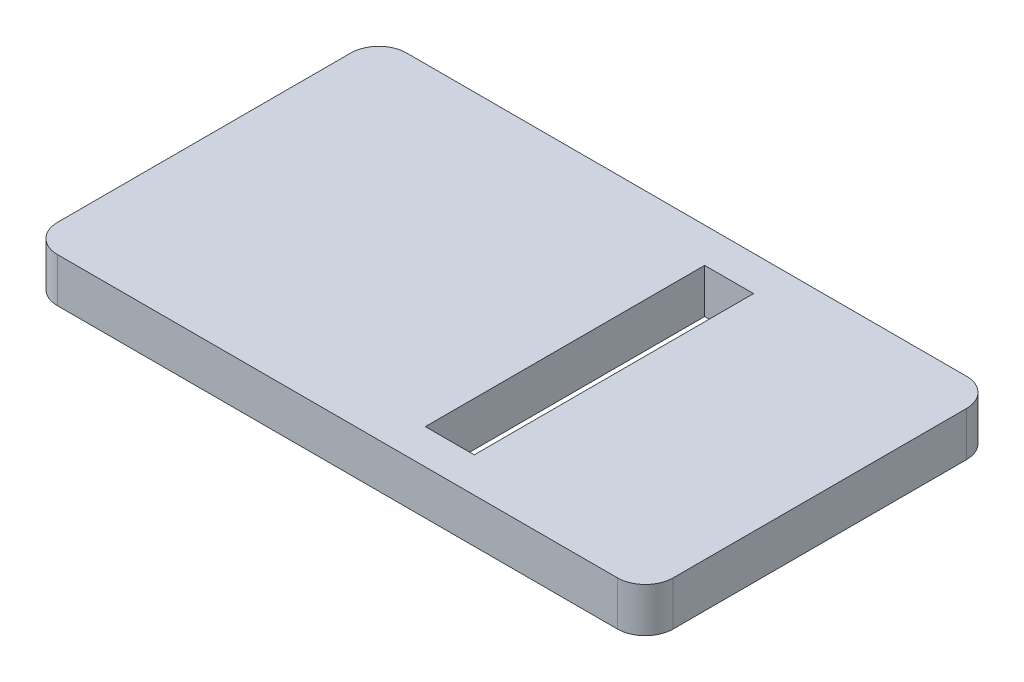
ISO-10303-21;
HEADER;
FILE_DESCRIPTION(('STEP AP214'),'2;1');
FILE_NAME('part.step','',(''),(''),'','','');
FILE_SCHEMA(('AUTOMOTIVE_DESIGN { 1 0 10303 214 1 1 1 1 }'));
ENDSEC;
DATA;
#1=APPLICATION_CONTEXT('core data for automotive mechanical design processes');
#2=APPLICATION_PROTOCOL_DEFINITION('international standard','automotive_design',2000,#1);
#3=PRODUCT_CONTEXT('',#1,'mechanical');
#4=PRODUCT('Part','Part','',(#3));
#5=PRODUCT_RELATED_PRODUCT_CATEGORY('part','',(#4));
#6=PRODUCT_DEFINITION_FORMATION('','',#4);
#7=PRODUCT_DEFINITION_CONTEXT('part definition',#1,'design');
#8=PRODUCT_DEFINITION('design','',#6,#7);
#9=PRODUCT_DEFINITION_SHAPE('','',#8);
#10=(LENGTH_UNIT() NAMED_UNIT(*) SI_UNIT(.MILLI.,.METRE.));
#11=(NAMED_UNIT(*) PLANE_ANGLE_UNIT() SI_UNIT($,.RADIAN.));
#12=(NAMED_UNIT(*) SI_UNIT($,.STERADIAN.) SOLID_ANGLE_UNIT());
#13=UNCERTAINTY_MEASURE_WITH_UNIT(LENGTH_MEASURE(1.E-05),#10,'distance_accuracy_value','');
#14=(GEOMETRIC_REPRESENTATION_CONTEXT(3) GLOBAL_UNCERTAINTY_ASSIGNED_CONTEXT((#13)) GLOBAL_UNIT_ASSIGNED_CONTEXT((#10,
#11,#12)) REPRESENTATION_CONTEXT('',''));
#15=CARTESIAN_POINT('',(0.,0.,0.));
#16=DIRECTION('',(0.,0.,1.));
#17=DIRECTION('',(1.,0.,0.));
#18=AXIS2_PLACEMENT_3D('',#15,#16,#17);
#19=CARTESIAN_POINT('',(0.,6.35,0.));
#20=DIRECTION('',(0.,1.,0.));
#21=DIRECTION('',(0.,0.,1.));
#22=AXIS2_PLACEMENT_3D('',#19,#20,#21);
#23=PLANE('',#22);
#24=DIRECTION('',(0.,0.,1.));
#25=VECTOR('',#24,1.);
#26=CARTESIAN_POINT('',(-44.09,6.35,-25.));
#27=LINE('',#26,#25);
#28=CARTESIAN_POINT('',(-44.09,6.35,-21.));
#29=VERTEX_POINT('',#28);
#30=CARTESIAN_POINT('',(-44.09,6.35,21.));
#31=VERTEX_POINT('',#30);
#32=EDGE_CURVE('E173',#29,#31,#27,.T.);
#33=ORIENTED_EDGE('',*,*,#32,.T.);
#34=CARTESIAN_POINT('',(-40.09,6.35,21.));
#35=DIRECTION('',(0.,1.,0.));
#36=DIRECTION('',(0.,0.,1.));
#37=AXIS2_PLACEMENT_3D('',#34,#35,#36);
#38=CIRCLE('',#37,4.);
#39=CARTESIAN_POINT('',(-40.09,6.35,25.));
#40=VERTEX_POINT('',#39);
#41=EDGE_CURVE('E211',#31,#40,#38,.T.);
#42=ORIENTED_EDGE('',*,*,#41,.T.);
#43=DIRECTION('',(1.,0.,0.));
#44=VECTOR('',#43,1.);
#45=CARTESIAN_POINT('',(-44.09,6.35,25.));
#46=LINE('',#45,#44);
#47=CARTESIAN_POINT('',(40.09,6.35,25.));
#48=VERTEX_POINT('',#47);
#49=EDGE_CURVE('E176',#40,#48,#46,.T.);
#50=ORIENTED_EDGE('',*,*,#49,.T.);
#51=CARTESIAN_POINT('',(40.09,6.35,21.));
#52=DIRECTION('',(0.,1.,0.));
#53=DIRECTION('',(0.,0.,1.));
#54=AXIS2_PLACEMENT_3D('',#51,#52,#53);
#55=CIRCLE('',#54,4.);
#56=CARTESIAN_POINT('',(44.09,6.35,21.));
#57=VERTEX_POINT('',#56);
#58=EDGE_CURVE('E207',#48,#57,#55,.T.);
#59=ORIENTED_EDGE('',*,*,#58,.T.);
#60=DIRECTION('',(0.,0.,-1.));
#61=VECTOR('',#60,1.);
#62=CARTESIAN_POINT('',(44.09,6.35,-25.));
#63=LINE('',#62,#61);
#64=CARTESIAN_POINT('',(44.09,6.35,-21.));
#65=VERTEX_POINT('',#64);
#66=EDGE_CURVE('E168',#57,#65,#63,.T.);
#67=ORIENTED_EDGE('',*,*,#66,.T.);
#68=CARTESIAN_POINT('',(40.09,6.35,-21.));
#69=DIRECTION('',(0.,1.,0.));
#70=DIRECTION('',(0.,0.,1.));
#71=AXIS2_PLACEMENT_3D('',#68,#69,#70);
#72=CIRCLE('',#71,4.);
#73=CARTESIAN_POINT('',(40.09,6.35,-25.));
#74=VERTEX_POINT('',#73);
#75=EDGE_CURVE('E57',#65,#74,#72,.T.);
#76=ORIENTED_EDGE('',*,*,#75,.T.);
#77=DIRECTION('',(-1.,0.,0.));
#78=VECTOR('',#77,1.);
#79=CARTESIAN_POINT('',(-44.09,6.35,-25.));
#80=LINE('',#79,#78);
#81=CARTESIAN_POINT('',(-40.09,6.35,-25.));
#82=VERTEX_POINT('',#81);
#83=EDGE_CURVE('E170',#74,#82,#80,.T.);
#84=ORIENTED_EDGE('',*,*,#83,.T.);
#85=CARTESIAN_POINT('',(-40.09,6.35,-21.));
#86=DIRECTION('',(0.,1.,0.));
#87=DIRECTION('',(0.,0.,1.));
#88=AXIS2_PLACEMENT_3D('',#85,#86,#87);
#89=CIRCLE('',#88,4.);
#90=EDGE_CURVE('E209',#82,#29,#89,.T.);
#91=ORIENTED_EDGE('',*,*,#90,.T.);
#92=EDGE_LOOP('',(#33,#42,#50,#59,#67,#76,#84,#91));
#93=FACE_BOUND('',#92,.T.);
#94=DIRECTION('',(1.,0.,0.));
#95=VECTOR('',#94,1.);
#96=CARTESIAN_POINT('',(7.59000000000001,6.35,20.));
#97=LINE('',#96,#95);
#98=CARTESIAN_POINT('',(7.59000000000001,6.35,20.));
#99=VERTEX_POINT('',#98);
#100=CARTESIAN_POINT('',(14.59,6.35,20.));
#101=VERTEX_POINT('',#100);
#102=EDGE_CURVE('E137',#99,#101,#97,.T.);
#103=ORIENTED_EDGE('',*,*,#102,.F.);
#104=DIRECTION('',(0.,0.,1.));
#105=VECTOR('',#104,1.);
#106=CARTESIAN_POINT('',(7.59000000000001,6.35,-20.));
#107=LINE('',#106,#105);
#108=CARTESIAN_POINT('',(7.59000000000001,6.35,-20.));
#109=VERTEX_POINT('',#108);
#110=EDGE_CURVE('E127',#109,#99,#107,.T.);
#111=ORIENTED_EDGE('',*,*,#110,.F.);
#112=DIRECTION('',(-1.,0.,0.));
#113=VECTOR('',#112,1.);
#114=CARTESIAN_POINT('',(7.59000000000001,6.35,-20.));
#115=LINE('',#114,#113);
#116=CARTESIAN_POINT('',(14.59,6.35,-20.));
#117=VERTEX_POINT('',#116);
#118=EDGE_CURVE('E152',#117,#109,#115,.T.);
#119=ORIENTED_EDGE('',*,*,#118,.F.);
#120=DIRECTION('',(0.,0.,-1.));
#121=VECTOR('',#120,1.);
#122=CARTESIAN_POINT('',(14.59,6.35,-20.));
#123=LINE('',#122,#121);
#124=EDGE_CURVE('E150',#101,#117,#123,.T.);
#125=ORIENTED_EDGE('',*,*,#124,.F.);
#126=EDGE_LOOP('',(#103,#111,#119,#125));
#127=FACE_BOUND('',#126,.T.);
#128=ADVANCED_FACE('F35',(#93,#127),#23,.T.);
#129=CARTESIAN_POINT('',(0.,0.,0.));
#130=DIRECTION('',(0.,1.,0.));
#131=DIRECTION('',(0.,0.,1.));
#132=AXIS2_PLACEMENT_3D('',#129,#130,#131);
#133=PLANE('',#132);
#134=DIRECTION('',(1.,0.,0.));
#135=VECTOR('',#134,1.);
#136=CARTESIAN_POINT('',(-44.09,0.,25.));
#137=LINE('',#136,#135);
#138=CARTESIAN_POINT('',(-40.09,0.,25.));
#139=VERTEX_POINT('',#138);
#140=CARTESIAN_POINT('',(40.09,0.,25.));
#141=VERTEX_POINT('',#140);
#142=EDGE_CURVE('E171',#139,#141,#137,.T.);
#143=ORIENTED_EDGE('',*,*,#142,.F.);
#144=CARTESIAN_POINT('',(-40.09,0.,21.));
#145=DIRECTION('',(0.,1.,0.));
#146=DIRECTION('',(0.,0.,1.));
#147=AXIS2_PLACEMENT_3D('',#144,#145,#146);
#148=CIRCLE('',#147,4.);
#149=CARTESIAN_POINT('',(-44.09,0.,21.));
#150=VERTEX_POINT('',#149);
#151=EDGE_CURVE('E199',#139,#150,#148,.F.);
#152=ORIENTED_EDGE('',*,*,#151,.T.);
#153=DIRECTION('',(0.,0.,1.));
#154=VECTOR('',#153,1.);
#155=CARTESIAN_POINT('',(-44.09,0.,-25.));
#156=LINE('',#155,#154);
#157=CARTESIAN_POINT('',(-44.09,0.,-21.));
#158=VERTEX_POINT('',#157);
#159=EDGE_CURVE('E184',#158,#150,#156,.T.);
#160=ORIENTED_EDGE('',*,*,#159,.F.);
#161=CARTESIAN_POINT('',(-40.09,0.,-21.));
#162=DIRECTION('',(0.,1.,0.));
#163=DIRECTION('',(0.,0.,1.));
#164=AXIS2_PLACEMENT_3D('',#161,#162,#163);
#165=CIRCLE('',#164,4.);
#166=CARTESIAN_POINT('',(-40.09,0.,-25.));
#167=VERTEX_POINT('',#166);
#168=EDGE_CURVE('E197',#158,#167,#165,.F.);
#169=ORIENTED_EDGE('',*,*,#168,.T.);
#170=DIRECTION('',(-1.,0.,0.));
#171=VECTOR('',#170,1.);
#172=CARTESIAN_POINT('',(-44.09,0.,-25.));
#173=LINE('',#172,#171);
#174=CARTESIAN_POINT('',(40.09,0.,-25.));
#175=VERTEX_POINT('',#174);
#176=EDGE_CURVE('E182',#175,#167,#173,.T.);
#177=ORIENTED_EDGE('',*,*,#176,.F.);
#178=CARTESIAN_POINT('',(40.09,0.,-21.));
#179=DIRECTION('',(0.,1.,0.));
#180=DIRECTION('',(0.,0.,1.));
#181=AXIS2_PLACEMENT_3D('',#178,#179,#180);
#182=CIRCLE('',#181,4.);
#183=CARTESIAN_POINT('',(44.09,0.,-21.));
#184=VERTEX_POINT('',#183);
#185=EDGE_CURVE('E193',#175,#184,#182,.F.);
#186=ORIENTED_EDGE('',*,*,#185,.T.);
#187=DIRECTION('',(0.,0.,-1.));
#188=VECTOR('',#187,1.);
#189=CARTESIAN_POINT('',(44.09,0.,-25.));
#190=LINE('',#189,#188);
#191=CARTESIAN_POINT('',(44.09,0.,21.));
#192=VERTEX_POINT('',#191);
#193=EDGE_CURVE('E145',#192,#184,#190,.T.);
#194=ORIENTED_EDGE('',*,*,#193,.F.);
#195=CARTESIAN_POINT('',(40.09,0.,21.));
#196=DIRECTION('',(0.,1.,0.));
#197=DIRECTION('',(0.,0.,1.));
#198=AXIS2_PLACEMENT_3D('',#195,#196,#197);
#199=CIRCLE('',#198,4.);
#200=EDGE_CURVE('E195',#192,#141,#199,.F.);
#201=ORIENTED_EDGE('',*,*,#200,.T.);
#202=EDGE_LOOP('',(#143,#152,#160,#169,#177,#186,#194,#201));
#203=FACE_BOUND('',#202,.T.);
#204=DIRECTION('',(0.,0.,1.));
#205=VECTOR('',#204,1.);
#206=CARTESIAN_POINT('',(7.59000000000001,0.,-20.));
#207=LINE('',#206,#205);
#208=CARTESIAN_POINT('',(7.59000000000001,0.,-20.));
#209=VERTEX_POINT('',#208);
#210=CARTESIAN_POINT('',(7.59000000000001,0.,20.));
#211=VERTEX_POINT('',#210);
#212=EDGE_CURVE('E156',#209,#211,#207,.T.);
#213=ORIENTED_EDGE('',*,*,#212,.T.);
#214=DIRECTION('',(1.,0.,0.));
#215=VECTOR('',#214,1.);
#216=CARTESIAN_POINT('',(7.59000000000001,0.,20.));
#217=LINE('',#216,#215);
#218=CARTESIAN_POINT('',(14.59,0.,20.));
#219=VERTEX_POINT('',#218);
#220=EDGE_CURVE('E144',#211,#219,#217,.T.);
#221=ORIENTED_EDGE('',*,*,#220,.T.);
#222=DIRECTION('',(0.,0.,-1.));
#223=VECTOR('',#222,1.);
#224=CARTESIAN_POINT('',(14.59,0.,-20.));
#225=LINE('',#224,#223);
#226=CARTESIAN_POINT('',(14.59,0.,-20.));
#227=VERTEX_POINT('',#226);
#228=EDGE_CURVE('E159',#219,#227,#225,.T.);
#229=ORIENTED_EDGE('',*,*,#228,.T.);
#230=DIRECTION('',(-1.,0.,0.));
#231=VECTOR('',#230,1.);
#232=CARTESIAN_POINT('',(7.59000000000001,0.,-20.));
#233=LINE('',#232,#231);
#234=EDGE_CURVE('E138',#227,#209,#233,.T.);
#235=ORIENTED_EDGE('',*,*,#234,.T.);
#236=EDGE_LOOP('',(#213,#221,#229,#235));
#237=FACE_BOUND('',#236,.T.);
#238=ADVANCED_FACE('F229',(#203,#237),#133,.F.);
#239=CARTESIAN_POINT('',(44.09,6.35,-25.));
#240=DIRECTION('',(-1.,0.,0.));
#241=DIRECTION('',(0.,0.,1.));
#242=AXIS2_PLACEMENT_3D('',#239,#240,#241);
#243=PLANE('',#242);
#244=ORIENTED_EDGE('',*,*,#66,.F.);
#245=DIRECTION('',(0.,-1.,0.));
#246=VECTOR('',#245,1.);
#247=CARTESIAN_POINT('',(44.09,6.35,21.));
#248=LINE('',#247,#246);
#249=EDGE_CURVE('E11',#57,#192,#248,.T.);
#250=ORIENTED_EDGE('',*,*,#249,.T.);
#251=ORIENTED_EDGE('',*,*,#193,.T.);
#252=DIRECTION('',(0.,-1.,0.));
#253=VECTOR('',#252,1.);
#254=CARTESIAN_POINT('',(44.09,6.35,-21.));
#255=LINE('',#254,#253);
#256=EDGE_CURVE('E43',#184,#65,#255,.F.);
#257=ORIENTED_EDGE('',*,*,#256,.T.);
#258=EDGE_LOOP('',(#244,#250,#251,#257));
#259=FACE_BOUND('',#258,.T.);
#260=ADVANCED_FACE('F219',(#259),#243,.F.);
#261=CARTESIAN_POINT('',(-44.09,6.35,-25.));
#262=DIRECTION('',(0.,0.,1.));
#263=DIRECTION('',(1.,0.,0.));
#264=AXIS2_PLACEMENT_3D('',#261,#262,#263);
#265=PLANE('',#264);
#266=ORIENTED_EDGE('',*,*,#176,.T.);
#267=DIRECTION('',(0.,-1.,0.));
#268=VECTOR('',#267,1.);
#269=CARTESIAN_POINT('',(-40.09,6.35,-25.));
#270=LINE('',#269,#268);
#271=EDGE_CURVE('E50',#167,#82,#270,.F.);
#272=ORIENTED_EDGE('',*,*,#271,.T.);
#273=ORIENTED_EDGE('',*,*,#83,.F.);
#274=DIRECTION('',(0.,-1.,0.));
#275=VECTOR('',#274,1.);
#276=CARTESIAN_POINT('',(40.09,6.35,-25.));
#277=LINE('',#276,#275);
#278=EDGE_CURVE('E213',#74,#175,#277,.T.);
#279=ORIENTED_EDGE('',*,*,#278,.T.);
#280=EDGE_LOOP('',(#266,#272,#273,#279));
#281=FACE_BOUND('',#280,.T.);
#282=ADVANCED_FACE('F226',(#281),#265,.F.);
#283=CARTESIAN_POINT('',(-44.09,6.35,-25.));
#284=DIRECTION('',(1.,0.,0.));
#285=DIRECTION('',(0.,0.,-1.));
#286=AXIS2_PLACEMENT_3D('',#283,#284,#285);
#287=PLANE('',#286);
#288=ORIENTED_EDGE('',*,*,#159,.T.);
#289=DIRECTION('',(0.,-1.,0.));
#290=VECTOR('',#289,1.);
#291=CARTESIAN_POINT('',(-44.09,6.35,21.));
#292=LINE('',#291,#290);
#293=EDGE_CURVE('E204',#150,#31,#292,.F.);
#294=ORIENTED_EDGE('',*,*,#293,.T.);
#295=ORIENTED_EDGE('',*,*,#32,.F.);
#296=DIRECTION('',(0.,-1.,0.));
#297=VECTOR('',#296,1.);
#298=CARTESIAN_POINT('',(-44.09,6.35,-21.));
#299=LINE('',#298,#297);
#300=EDGE_CURVE('E201',#29,#158,#299,.T.);
#301=ORIENTED_EDGE('',*,*,#300,.T.);
#302=EDGE_LOOP('',(#288,#294,#295,#301));
#303=FACE_BOUND('',#302,.T.);
#304=ADVANCED_FACE('F238',(#303),#287,.F.);
#305=CARTESIAN_POINT('',(-44.09,6.35,25.));
#306=DIRECTION('',(0.,0.,-1.));
#307=DIRECTION('',(-1.,0.,0.));
#308=AXIS2_PLACEMENT_3D('',#305,#306,#307);
#309=PLANE('',#308);
#310=ORIENTED_EDGE('',*,*,#49,.F.);
#311=DIRECTION('',(0.,-1.,0.));
#312=VECTOR('',#311,1.);
#313=CARTESIAN_POINT('',(-40.09,6.35,25.));
#314=LINE('',#313,#312);
#315=EDGE_CURVE('E190',#40,#139,#314,.T.);
#316=ORIENTED_EDGE('',*,*,#315,.T.);
#317=ORIENTED_EDGE('',*,*,#142,.T.);
#318=DIRECTION('',(0.,-1.,0.));
#319=VECTOR('',#318,1.);
#320=CARTESIAN_POINT('',(40.09,6.35,25.));
#321=LINE('',#320,#319);
#322=EDGE_CURVE('E179',#141,#48,#321,.F.);
#323=ORIENTED_EDGE('',*,*,#322,.T.);
#324=EDGE_LOOP('',(#310,#316,#317,#323));
#325=FACE_BOUND('',#324,.T.);
#326=ADVANCED_FACE('F246',(#325),#309,.F.);
#327=CARTESIAN_POINT('',(7.59000000000001,6.35,-20.));
#328=DIRECTION('',(1.,0.,0.));
#329=DIRECTION('',(0.,0.,-1.));
#330=AXIS2_PLACEMENT_3D('',#327,#328,#329);
#331=PLANE('',#330);
#332=ORIENTED_EDGE('',*,*,#212,.F.);
#333=DIRECTION('',(0.,-1.,0.));
#334=VECTOR('',#333,1.);
#335=CARTESIAN_POINT('',(7.59000000000001,6.35,-20.));
#336=LINE('',#335,#334);
#337=EDGE_CURVE('E133',#109,#209,#336,.T.);
#338=ORIENTED_EDGE('',*,*,#337,.F.);
#339=ORIENTED_EDGE('',*,*,#110,.T.);
#340=DIRECTION('',(0.,-1.,0.));
#341=VECTOR('',#340,1.);
#342=CARTESIAN_POINT('',(7.59000000000001,6.35,20.));
#343=LINE('',#342,#341);
#344=EDGE_CURVE('E130',#99,#211,#343,.T.);
#345=ORIENTED_EDGE('',*,*,#344,.T.);
#346=EDGE_LOOP('',(#332,#338,#339,#345));
#347=FACE_BOUND('',#346,.T.);
#348=ADVANCED_FACE('F129',(#347),#331,.T.);
#349=CARTESIAN_POINT('',(7.59000000000001,6.35,20.));
#350=DIRECTION('',(0.,0.,-1.));
#351=DIRECTION('',(-1.,0.,0.));
#352=AXIS2_PLACEMENT_3D('',#349,#350,#351);
#353=PLANE('',#352);
#354=ORIENTED_EDGE('',*,*,#220,.F.);
#355=ORIENTED_EDGE('',*,*,#344,.F.);
#356=ORIENTED_EDGE('',*,*,#102,.T.);
#357=DIRECTION('',(0.,-1.,0.));
#358=VECTOR('',#357,1.);
#359=CARTESIAN_POINT('',(14.59,6.35,20.));
#360=LINE('',#359,#358);
#361=EDGE_CURVE('E146',#101,#219,#360,.T.);
#362=ORIENTED_EDGE('',*,*,#361,.T.);
#363=EDGE_LOOP('',(#354,#355,#356,#362));
#364=FACE_BOUND('',#363,.T.);
#365=ADVANCED_FACE('F141',(#364),#353,.T.);
#366=CARTESIAN_POINT('',(14.59,6.35,-20.));
#367=DIRECTION('',(-1.,0.,0.));
#368=DIRECTION('',(0.,0.,1.));
#369=AXIS2_PLACEMENT_3D('',#366,#367,#368);
#370=PLANE('',#369);
#371=ORIENTED_EDGE('',*,*,#228,.F.);
#372=ORIENTED_EDGE('',*,*,#361,.F.);
#373=ORIENTED_EDGE('',*,*,#124,.T.);
#374=DIRECTION('',(0.,-1.,0.));
#375=VECTOR('',#374,1.);
#376=CARTESIAN_POINT('',(14.59,6.35,-20.));
#377=LINE('',#376,#375);
#378=EDGE_CURVE('E165',#117,#227,#377,.T.);
#379=ORIENTED_EDGE('',*,*,#378,.T.);
#380=EDGE_LOOP('',(#371,#372,#373,#379));
#381=FACE_BOUND('',#380,.T.);
#382=ADVANCED_FACE('F278',(#381),#370,.T.);
#383=CARTESIAN_POINT('',(7.59000000000001,6.35,-20.));
#384=DIRECTION('',(0.,0.,1.));
#385=DIRECTION('',(1.,0.,0.));
#386=AXIS2_PLACEMENT_3D('',#383,#384,#385);
#387=PLANE('',#386);
#388=ORIENTED_EDGE('',*,*,#234,.F.);
#389=ORIENTED_EDGE('',*,*,#378,.F.);
#390=ORIENTED_EDGE('',*,*,#118,.T.);
#391=ORIENTED_EDGE('',*,*,#337,.T.);
#392=EDGE_LOOP('',(#388,#389,#390,#391));
#393=FACE_BOUND('',#392,.T.);
#394=ADVANCED_FACE('F274',(#393),#387,.T.);
#395=CARTESIAN_POINT('',(-40.09,6.35,21.));
#396=DIRECTION('',(0.,-1.,0.));
#397=DIRECTION('',(0.,0.,-1.));
#398=AXIS2_PLACEMENT_3D('',#395,#396,#397);
#399=CYLINDRICAL_SURFACE('',#398,4.);
#400=ORIENTED_EDGE('',*,*,#41,.F.);
#401=ORIENTED_EDGE('',*,*,#293,.F.);
#402=ORIENTED_EDGE('',*,*,#151,.F.);
#403=ORIENTED_EDGE('',*,*,#315,.F.);
#404=EDGE_LOOP('',(#400,#401,#402,#403));
#405=FACE_BOUND('',#404,.T.);
#406=ADVANCED_FACE('F244',(#405),#399,.T.);
#407=CARTESIAN_POINT('',(-40.09,6.35,-21.));
#408=DIRECTION('',(0.,-1.,0.));
#409=DIRECTION('',(0.,0.,-1.));
#410=AXIS2_PLACEMENT_3D('',#407,#408,#409);
#411=CYLINDRICAL_SURFACE('',#410,4.);
#412=ORIENTED_EDGE('',*,*,#90,.F.);
#413=ORIENTED_EDGE('',*,*,#271,.F.);
#414=ORIENTED_EDGE('',*,*,#168,.F.);
#415=ORIENTED_EDGE('',*,*,#300,.F.);
#416=EDGE_LOOP('',(#412,#413,#414,#415));
#417=FACE_BOUND('',#416,.T.);
#418=ADVANCED_FACE('F235',(#417),#411,.T.);
#419=CARTESIAN_POINT('',(40.09,6.35,21.));
#420=DIRECTION('',(0.,-1.,0.));
#421=DIRECTION('',(0.,0.,-1.));
#422=AXIS2_PLACEMENT_3D('',#419,#420,#421);
#423=CYLINDRICAL_SURFACE('',#422,4.);
#424=ORIENTED_EDGE('',*,*,#58,.F.);
#425=ORIENTED_EDGE('',*,*,#322,.F.);
#426=ORIENTED_EDGE('',*,*,#200,.F.);
#427=ORIENTED_EDGE('',*,*,#249,.F.);
#428=EDGE_LOOP('',(#424,#425,#426,#427));
#429=FACE_BOUND('',#428,.T.);
#430=ADVANCED_FACE('F249',(#429),#423,.T.);
#431=CARTESIAN_POINT('',(40.09,6.35,-21.));
#432=DIRECTION('',(0.,-1.,0.));
#433=DIRECTION('',(0.,0.,-1.));
#434=AXIS2_PLACEMENT_3D('',#431,#432,#433);
#435=CYLINDRICAL_SURFACE('',#434,4.);
#436=ORIENTED_EDGE('',*,*,#75,.F.);
#437=ORIENTED_EDGE('',*,*,#256,.F.);
#438=ORIENTED_EDGE('',*,*,#185,.F.);
#439=ORIENTED_EDGE('',*,*,#278,.F.);
#440=EDGE_LOOP('',(#436,#437,#438,#439));
#441=FACE_BOUND('',#440,.T.);
#442=ADVANCED_FACE('F37',(#441),#435,.T.);
#443=CLOSED_SHELL('',(#128,#238,#260,#282,#304,#326,#348,#365,#382,#394,#406,#418,#430,#442));
#444=MANIFOLD_SOLID_BREP('B2',#443);
#445=ADVANCED_BREP_SHAPE_REPRESENTATION('',(#18,#444),#14);
#446=SHAPE_DEFINITION_REPRESENTATION(#9,#445);
ENDSEC;
END-ISO-10303-21;
